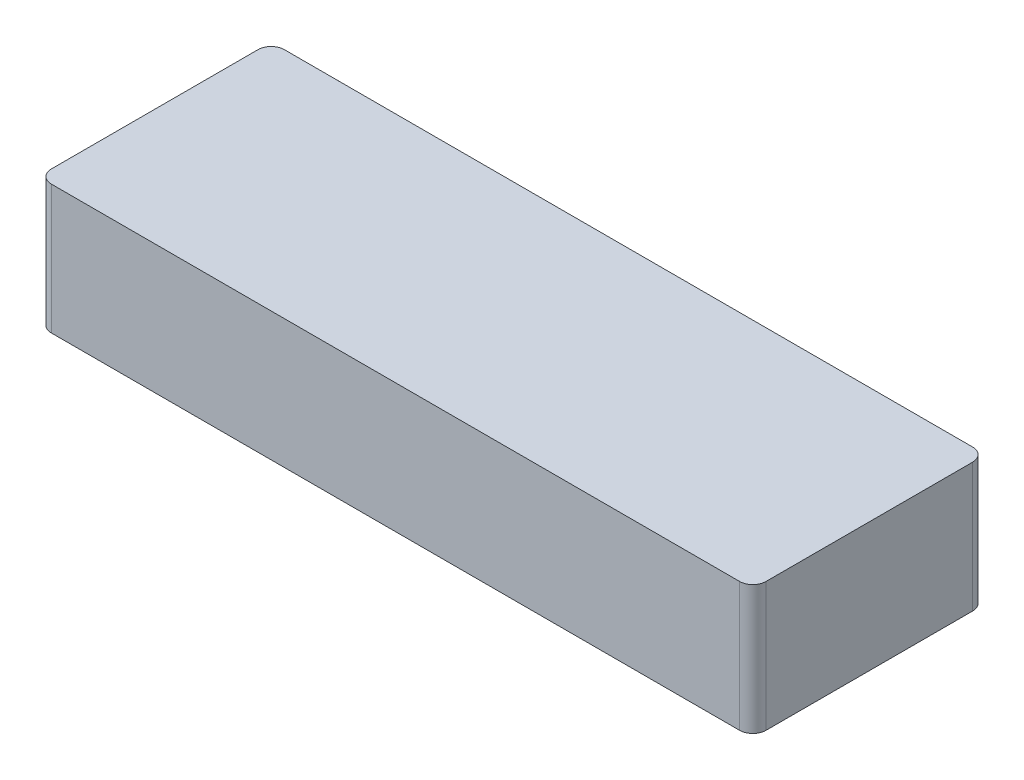
ISO-10303-21;
HEADER;
FILE_DESCRIPTION(('STEP AP214'),'2;1');
FILE_NAME('part.step','',(''),(''),'','','');
FILE_SCHEMA(('AUTOMOTIVE_DESIGN { 1 0 10303 214 1 1 1 1 }'));
ENDSEC;
DATA;
#1=APPLICATION_CONTEXT('core data for automotive mechanical design processes');
#2=APPLICATION_PROTOCOL_DEFINITION('international standard','automotive_design',2000,#1);
#3=PRODUCT_CONTEXT('',#1,'mechanical');
#4=PRODUCT('Part','Part','',(#3));
#5=PRODUCT_RELATED_PRODUCT_CATEGORY('part','',(#4));
#6=PRODUCT_DEFINITION_FORMATION('','',#4);
#7=PRODUCT_DEFINITION_CONTEXT('part definition',#1,'design');
#8=PRODUCT_DEFINITION('design','',#6,#7);
#9=PRODUCT_DEFINITION_SHAPE('','',#8);
#10=(LENGTH_UNIT() NAMED_UNIT(*) SI_UNIT(.MILLI.,.METRE.));
#11=(NAMED_UNIT(*) PLANE_ANGLE_UNIT() SI_UNIT($,.RADIAN.));
#12=(NAMED_UNIT(*) SI_UNIT($,.STERADIAN.) SOLID_ANGLE_UNIT());
#13=UNCERTAINTY_MEASURE_WITH_UNIT(LENGTH_MEASURE(1.E-05),#10,'distance_accuracy_value','');
#14=(GEOMETRIC_REPRESENTATION_CONTEXT(3) GLOBAL_UNCERTAINTY_ASSIGNED_CONTEXT((#13)) GLOBAL_UNIT_ASSIGNED_CONTEXT((#10,
#11,#12)) REPRESENTATION_CONTEXT('',''));
#15=CARTESIAN_POINT('',(0.,0.,0.));
#16=DIRECTION('',(0.,0.,1.));
#17=DIRECTION('',(1.,0.,0.));
#18=AXIS2_PLACEMENT_3D('',#15,#16,#17);
#19=CARTESIAN_POINT('',(0.,24.892,0.));
#20=DIRECTION('',(1.,0.,0.));
#21=DIRECTION('',(0.,0.,-1.));
#22=AXIS2_PLACEMENT_3D('',#19,#20,#21);
#23=PLANE('',#22);
#24=DIRECTION('',(0.,0.,1.));
#25=VECTOR('',#24,1.);
#26=CARTESIAN_POINT('',(0.,24.892,0.));
#27=LINE('',#26,#25);
#28=CARTESIAN_POINT('',(0.,24.892,-42.418));
#29=VERTEX_POINT('',#28);
#30=CARTESIAN_POINT('',(0.,24.892,-2.54));
#31=VERTEX_POINT('',#30);
#32=EDGE_CURVE('E137',#29,#31,#27,.T.);
#33=ORIENTED_EDGE('',*,*,#32,.F.);
#34=DIRECTION('',(0.,-1.,0.));
#35=VECTOR('',#34,1.);
#36=CARTESIAN_POINT('',(0.,24.892,-42.418));
#37=LINE('',#36,#35);
#38=CARTESIAN_POINT('',(0.,0.,-42.418));
#39=VERTEX_POINT('',#38);
#40=EDGE_CURVE('E11',#29,#39,#37,.T.);
#41=ORIENTED_EDGE('',*,*,#40,.T.);
#42=DIRECTION('',(0.,0.,1.));
#43=VECTOR('',#42,1.);
#44=CARTESIAN_POINT('',(0.,0.,0.));
#45=LINE('',#44,#43);
#46=CARTESIAN_POINT('',(0.,0.,-2.54));
#47=VERTEX_POINT('',#46);
#48=EDGE_CURVE('E183',#39,#47,#45,.T.);
#49=ORIENTED_EDGE('',*,*,#48,.T.);
#50=DIRECTION('',(0.,-1.,0.));
#51=VECTOR('',#50,1.);
#52=CARTESIAN_POINT('',(0.,24.892,-2.54));
#53=LINE('',#52,#51);
#54=EDGE_CURVE('E48',#47,#31,#53,.F.);
#55=ORIENTED_EDGE('',*,*,#54,.T.);
#56=EDGE_LOOP('',(#33,#41,#49,#55));
#57=FACE_BOUND('',#56,.T.);
#58=ADVANCED_FACE('F39',(#57),#23,.F.);
#59=CARTESIAN_POINT('',(0.,24.892,0.));
#60=DIRECTION('',(0.,0.,-1.));
#61=DIRECTION('',(-1.,0.,0.));
#62=AXIS2_PLACEMENT_3D('',#59,#60,#61);
#63=PLANE('',#62);
#64=DIRECTION('',(1.,0.,0.));
#65=VECTOR('',#64,1.);
#66=CARTESIAN_POINT('',(0.,0.,0.));
#67=LINE('',#66,#65);
#68=CARTESIAN_POINT('',(2.54,0.,0.));
#69=VERTEX_POINT('',#68);
#70=CARTESIAN_POINT('',(135.382,0.,0.));
#71=VERTEX_POINT('',#70);
#72=EDGE_CURVE('E144',#69,#71,#67,.T.);
#73=ORIENTED_EDGE('',*,*,#72,.T.);
#74=DIRECTION('',(0.,-1.,0.));
#75=VECTOR('',#74,1.);
#76=CARTESIAN_POINT('',(135.382,24.892,0.));
#77=LINE('',#76,#75);
#78=CARTESIAN_POINT('',(135.382,24.892,0.));
#79=VERTEX_POINT('',#78);
#80=EDGE_CURVE('E55',#71,#79,#77,.F.);
#81=ORIENTED_EDGE('',*,*,#80,.T.);
#82=DIRECTION('',(1.,0.,0.));
#83=VECTOR('',#82,1.);
#84=CARTESIAN_POINT('',(0.,24.892,0.));
#85=LINE('',#84,#83);
#86=CARTESIAN_POINT('',(2.54,24.892,0.));
#87=VERTEX_POINT('',#86);
#88=EDGE_CURVE('E142',#87,#79,#85,.T.);
#89=ORIENTED_EDGE('',*,*,#88,.F.);
#90=DIRECTION('',(0.,-1.,0.));
#91=VECTOR('',#90,1.);
#92=CARTESIAN_POINT('',(2.54,24.892,0.));
#93=LINE('',#92,#91);
#94=EDGE_CURVE('E172',#87,#69,#93,.T.);
#95=ORIENTED_EDGE('',*,*,#94,.T.);
#96=EDGE_LOOP('',(#73,#81,#89,#95));
#97=FACE_BOUND('',#96,.T.);
#98=ADVANCED_FACE('F190',(#97),#63,.F.);
#99=CARTESIAN_POINT('',(137.922,24.892,0.));
#100=DIRECTION('',(-1.,0.,0.));
#101=DIRECTION('',(0.,0.,1.));
#102=AXIS2_PLACEMENT_3D('',#99,#100,#101);
#103=PLANE('',#102);
#104=DIRECTION('',(0.,0.,-1.));
#105=VECTOR('',#104,1.);
#106=CARTESIAN_POINT('',(137.922,0.,0.));
#107=LINE('',#106,#105);
#108=CARTESIAN_POINT('',(137.922,0.,-2.54));
#109=VERTEX_POINT('',#108);
#110=CARTESIAN_POINT('',(137.922,0.,-42.418));
#111=VERTEX_POINT('',#110);
#112=EDGE_CURVE('E138',#109,#111,#107,.T.);
#113=ORIENTED_EDGE('',*,*,#112,.T.);
#114=DIRECTION('',(0.,-1.,0.));
#115=VECTOR('',#114,1.);
#116=CARTESIAN_POINT('',(137.922,24.892,-42.418));
#117=LINE('',#116,#115);
#118=CARTESIAN_POINT('',(137.922,24.892,-42.418));
#119=VERTEX_POINT('',#118);
#120=EDGE_CURVE('E112',#111,#119,#117,.F.);
#121=ORIENTED_EDGE('',*,*,#120,.T.);
#122=DIRECTION('',(0.,0.,-1.));
#123=VECTOR('',#122,1.);
#124=CARTESIAN_POINT('',(137.922,24.892,0.));
#125=LINE('',#124,#123);
#126=CARTESIAN_POINT('',(137.922,24.892,-2.54));
#127=VERTEX_POINT('',#126);
#128=EDGE_CURVE('E197',#127,#119,#125,.T.);
#129=ORIENTED_EDGE('',*,*,#128,.F.);
#130=DIRECTION('',(0.,-1.,0.));
#131=VECTOR('',#130,1.);
#132=CARTESIAN_POINT('',(137.922,24.892,-2.54));
#133=LINE('',#132,#131);
#134=EDGE_CURVE('E118',#127,#109,#133,.T.);
#135=ORIENTED_EDGE('',*,*,#134,.T.);
#136=EDGE_LOOP('',(#113,#121,#129,#135));
#137=FACE_BOUND('',#136,.T.);
#138=ADVANCED_FACE('F207',(#137),#103,.F.);
#139=CARTESIAN_POINT('',(0.,24.892,-44.958));
#140=DIRECTION('',(0.,0.,1.));
#141=DIRECTION('',(1.,0.,0.));
#142=AXIS2_PLACEMENT_3D('',#139,#140,#141);
#143=PLANE('',#142);
#144=DIRECTION('',(-1.,0.,0.));
#145=VECTOR('',#144,1.);
#146=CARTESIAN_POINT('',(0.,24.892,-44.958));
#147=LINE('',#146,#145);
#148=CARTESIAN_POINT('',(135.382,24.892,-44.958));
#149=VERTEX_POINT('',#148);
#150=CARTESIAN_POINT('',(2.54,24.892,-44.958));
#151=VERTEX_POINT('',#150);
#152=EDGE_CURVE('E128',#149,#151,#147,.T.);
#153=ORIENTED_EDGE('',*,*,#152,.F.);
#154=DIRECTION('',(0.,-1.,0.));
#155=VECTOR('',#154,1.);
#156=CARTESIAN_POINT('',(135.382,24.892,-44.958));
#157=LINE('',#156,#155);
#158=CARTESIAN_POINT('',(135.382,0.,-44.958));
#159=VERTEX_POINT('',#158);
#160=EDGE_CURVE('E111',#149,#159,#157,.T.);
#161=ORIENTED_EDGE('',*,*,#160,.T.);
#162=DIRECTION('',(-1.,0.,0.));
#163=VECTOR('',#162,1.);
#164=CARTESIAN_POINT('',(0.,0.,-44.958));
#165=LINE('',#164,#163);
#166=CARTESIAN_POINT('',(2.54,0.,-44.958));
#167=VERTEX_POINT('',#166);
#168=EDGE_CURVE('E125',#159,#167,#165,.T.);
#169=ORIENTED_EDGE('',*,*,#168,.T.);
#170=DIRECTION('',(0.,-1.,0.));
#171=VECTOR('',#170,1.);
#172=CARTESIAN_POINT('',(2.54,24.892,-44.958));
#173=LINE('',#172,#171);
#174=EDGE_CURVE('E131',#167,#151,#173,.F.);
#175=ORIENTED_EDGE('',*,*,#174,.T.);
#176=EDGE_LOOP('',(#153,#161,#169,#175));
#177=FACE_BOUND('',#176,.T.);
#178=ADVANCED_FACE('F124',(#177),#143,.F.);
#179=CARTESIAN_POINT('',(0.,24.892,0.));
#180=DIRECTION('',(0.,-1.,0.));
#181=DIRECTION('',(0.,0.,-1.));
#182=AXIS2_PLACEMENT_3D('',#179,#180,#181);
#183=PLANE('',#182);
#184=ORIENTED_EDGE('',*,*,#128,.T.);
#185=CARTESIAN_POINT('',(135.382,24.892,-42.418));
#186=DIRECTION('',(0.,-1.,0.));
#187=DIRECTION('',(0.,0.,-1.));
#188=AXIS2_PLACEMENT_3D('',#185,#186,#187);
#189=CIRCLE('',#188,2.54);
#190=EDGE_CURVE('E169',#119,#149,#189,.F.);
#191=ORIENTED_EDGE('',*,*,#190,.T.);
#192=ORIENTED_EDGE('',*,*,#152,.T.);
#193=CARTESIAN_POINT('',(2.54,24.892,-42.418));
#194=DIRECTION('',(0.,-1.,0.));
#195=DIRECTION('',(0.,0.,-1.));
#196=AXIS2_PLACEMENT_3D('',#193,#194,#195);
#197=CIRCLE('',#196,2.54);
#198=EDGE_CURVE('E163',#151,#29,#197,.F.);
#199=ORIENTED_EDGE('',*,*,#198,.T.);
#200=ORIENTED_EDGE('',*,*,#32,.T.);
#201=CARTESIAN_POINT('',(2.54,24.892,-2.54));
#202=DIRECTION('',(0.,-1.,0.));
#203=DIRECTION('',(0.,0.,-1.));
#204=AXIS2_PLACEMENT_3D('',#201,#202,#203);
#205=CIRCLE('',#204,2.54);
#206=EDGE_CURVE('E62',#31,#87,#205,.F.);
#207=ORIENTED_EDGE('',*,*,#206,.T.);
#208=ORIENTED_EDGE('',*,*,#88,.T.);
#209=CARTESIAN_POINT('',(135.382,24.892,-2.54));
#210=DIRECTION('',(0.,-1.,0.));
#211=DIRECTION('',(0.,0.,-1.));
#212=AXIS2_PLACEMENT_3D('',#209,#210,#211);
#213=CIRCLE('',#212,2.54);
#214=EDGE_CURVE('E166',#79,#127,#213,.F.);
#215=ORIENTED_EDGE('',*,*,#214,.T.);
#216=EDGE_LOOP('',(#184,#191,#192,#199,#200,#207,#208,#215));
#217=FACE_BOUND('',#216,.T.);
#218=ADVANCED_FACE('F186',(#217),#183,.F.);
#219=CARTESIAN_POINT('',(0.,0.,0.));
#220=DIRECTION('',(0.,-1.,0.));
#221=DIRECTION('',(0.,0.,-1.));
#222=AXIS2_PLACEMENT_3D('',#219,#220,#221);
#223=PLANE('',#222);
#224=ORIENTED_EDGE('',*,*,#168,.F.);
#225=CARTESIAN_POINT('',(135.382,0.,-42.418));
#226=DIRECTION('',(0.,-1.,0.));
#227=DIRECTION('',(0.,0.,-1.));
#228=AXIS2_PLACEMENT_3D('',#225,#226,#227);
#229=CIRCLE('',#228,2.54);
#230=EDGE_CURVE('E107',#159,#111,#229,.T.);
#231=ORIENTED_EDGE('',*,*,#230,.T.);
#232=ORIENTED_EDGE('',*,*,#112,.F.);
#233=CARTESIAN_POINT('',(135.382,0.,-2.54));
#234=DIRECTION('',(0.,-1.,0.));
#235=DIRECTION('',(0.,0.,-1.));
#236=AXIS2_PLACEMENT_3D('',#233,#234,#235);
#237=CIRCLE('',#236,2.54);
#238=EDGE_CURVE('E119',#109,#71,#237,.T.);
#239=ORIENTED_EDGE('',*,*,#238,.T.);
#240=ORIENTED_EDGE('',*,*,#72,.F.);
#241=CARTESIAN_POINT('',(2.54,0.,-2.54));
#242=DIRECTION('',(0.,-1.,0.));
#243=DIRECTION('',(0.,0.,-1.));
#244=AXIS2_PLACEMENT_3D('',#241,#242,#243);
#245=CIRCLE('',#244,2.54);
#246=EDGE_CURVE('E130',#69,#47,#245,.T.);
#247=ORIENTED_EDGE('',*,*,#246,.T.);
#248=ORIENTED_EDGE('',*,*,#48,.F.);
#249=CARTESIAN_POINT('',(2.54,0.,-42.418));
#250=DIRECTION('',(0.,-1.,0.));
#251=DIRECTION('',(0.,0.,-1.));
#252=AXIS2_PLACEMENT_3D('',#249,#250,#251);
#253=CIRCLE('',#252,2.54);
#254=EDGE_CURVE('E135',#39,#167,#253,.T.);
#255=ORIENTED_EDGE('',*,*,#254,.T.);
#256=EDGE_LOOP('',(#224,#231,#232,#239,#240,#247,#248,#255));
#257=FACE_BOUND('',#256,.T.);
#258=ADVANCED_FACE('F133',(#257),#223,.T.);
#259=CARTESIAN_POINT('',(135.382,24.892,-42.418));
#260=DIRECTION('',(0.,-1.,0.));
#261=DIRECTION('',(0.,0.,-1.));
#262=AXIS2_PLACEMENT_3D('',#259,#260,#261);
#263=CYLINDRICAL_SURFACE('',#262,2.54);
#264=ORIENTED_EDGE('',*,*,#190,.F.);
#265=ORIENTED_EDGE('',*,*,#120,.F.);
#266=ORIENTED_EDGE('',*,*,#230,.F.);
#267=ORIENTED_EDGE('',*,*,#160,.F.);
#268=EDGE_LOOP('',(#264,#265,#266,#267));
#269=FACE_BOUND('',#268,.T.);
#270=ADVANCED_FACE('F110',(#269),#263,.T.);
#271=CARTESIAN_POINT('',(135.382,24.892,-2.54));
#272=DIRECTION('',(0.,-1.,0.));
#273=DIRECTION('',(0.,0.,-1.));
#274=AXIS2_PLACEMENT_3D('',#271,#272,#273);
#275=CYLINDRICAL_SURFACE('',#274,2.54);
#276=ORIENTED_EDGE('',*,*,#214,.F.);
#277=ORIENTED_EDGE('',*,*,#80,.F.);
#278=ORIENTED_EDGE('',*,*,#238,.F.);
#279=ORIENTED_EDGE('',*,*,#134,.F.);
#280=EDGE_LOOP('',(#276,#277,#278,#279));
#281=FACE_BOUND('',#280,.T.);
#282=ADVANCED_FACE('F205',(#281),#275,.T.);
#283=CARTESIAN_POINT('',(2.54,24.892,-42.418));
#284=DIRECTION('',(0.,-1.,0.));
#285=DIRECTION('',(0.,0.,-1.));
#286=AXIS2_PLACEMENT_3D('',#283,#284,#285);
#287=CYLINDRICAL_SURFACE('',#286,2.54);
#288=ORIENTED_EDGE('',*,*,#198,.F.);
#289=ORIENTED_EDGE('',*,*,#174,.F.);
#290=ORIENTED_EDGE('',*,*,#254,.F.);
#291=ORIENTED_EDGE('',*,*,#40,.F.);
#292=EDGE_LOOP('',(#288,#289,#290,#291));
#293=FACE_BOUND('',#292,.T.);
#294=ADVANCED_FACE('F209',(#293),#287,.T.);
#295=CARTESIAN_POINT('',(2.54,24.892,-2.54));
#296=DIRECTION('',(0.,-1.,0.));
#297=DIRECTION('',(0.,0.,-1.));
#298=AXIS2_PLACEMENT_3D('',#295,#296,#297);
#299=CYLINDRICAL_SURFACE('',#298,2.54);
#300=ORIENTED_EDGE('',*,*,#206,.F.);
#301=ORIENTED_EDGE('',*,*,#54,.F.);
#302=ORIENTED_EDGE('',*,*,#246,.F.);
#303=ORIENTED_EDGE('',*,*,#94,.F.);
#304=EDGE_LOOP('',(#300,#301,#302,#303));
#305=FACE_BOUND('',#304,.T.);
#306=ADVANCED_FACE('F41',(#305),#299,.T.);
#307=CLOSED_SHELL('',(#58,#98,#138,#178,#218,#258,#270,#282,#294,#306));
#308=MANIFOLD_SOLID_BREP('B2',#307);
#309=ADVANCED_BREP_SHAPE_REPRESENTATION('',(#18,#308),#14);
#310=SHAPE_DEFINITION_REPRESENTATION(#9,#309);
ENDSEC;
END-ISO-10303-21;
